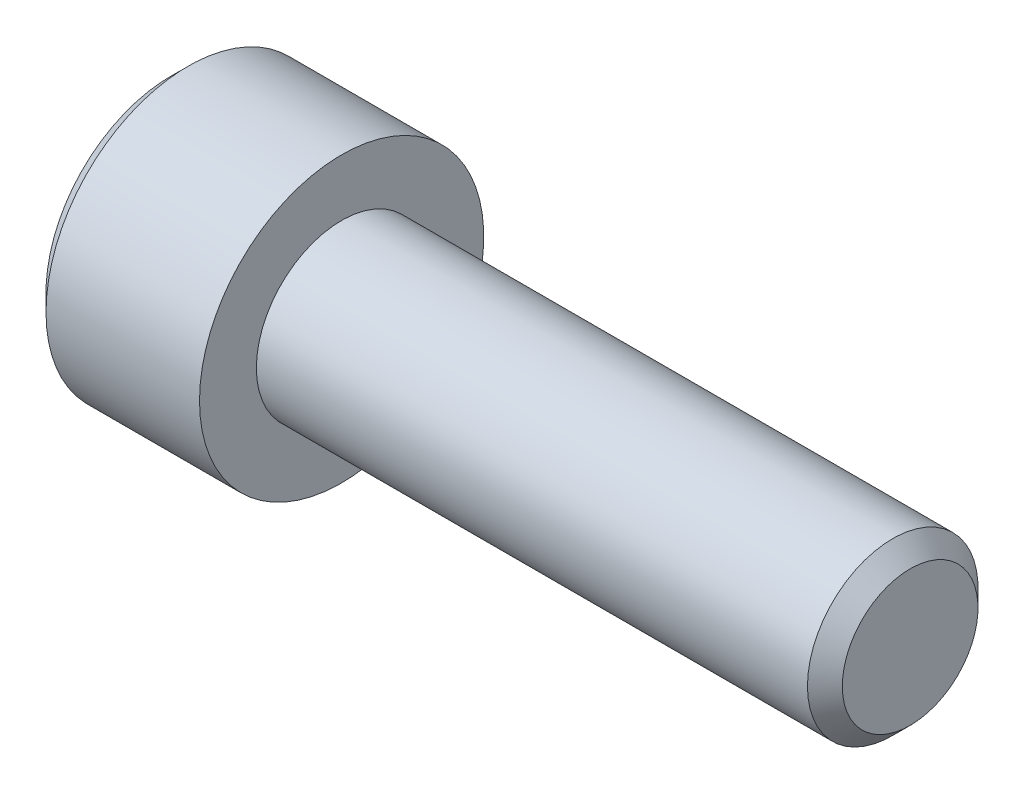
ISO-10303-21;
HEADER;
FILE_DESCRIPTION(('STEP AP214'),'2;1');
FILE_NAME('part.step','',(''),(''),'','','');
FILE_SCHEMA(('AUTOMOTIVE_DESIGN { 1 0 10303 214 1 1 1 1 }'));
ENDSEC;
DATA;
#1=APPLICATION_CONTEXT('core data for automotive mechanical design processes');
#2=APPLICATION_PROTOCOL_DEFINITION('international standard','automotive_design',2000,#1);
#3=PRODUCT_CONTEXT('',#1,'mechanical');
#4=PRODUCT('Part','Part','',(#3));
#5=PRODUCT_RELATED_PRODUCT_CATEGORY('part','',(#4));
#6=PRODUCT_DEFINITION_FORMATION('','',#4);
#7=PRODUCT_DEFINITION_CONTEXT('part definition',#1,'design');
#8=PRODUCT_DEFINITION('design','',#6,#7);
#9=PRODUCT_DEFINITION_SHAPE('','',#8);
#10=(LENGTH_UNIT() NAMED_UNIT(*) SI_UNIT(.MILLI.,.METRE.));
#11=(NAMED_UNIT(*) PLANE_ANGLE_UNIT() SI_UNIT($,.RADIAN.));
#12=(NAMED_UNIT(*) SI_UNIT($,.STERADIAN.) SOLID_ANGLE_UNIT());
#13=UNCERTAINTY_MEASURE_WITH_UNIT(LENGTH_MEASURE(1.E-05),#10,'distance_accuracy_value','');
#14=(GEOMETRIC_REPRESENTATION_CONTEXT(3) GLOBAL_UNCERTAINTY_ASSIGNED_CONTEXT((#13)) GLOBAL_UNIT_ASSIGNED_CONTEXT((#10,
#11,#12)) REPRESENTATION_CONTEXT('',''));
#15=CARTESIAN_POINT('',(0.,0.,0.));
#16=DIRECTION('',(0.,0.,1.));
#17=DIRECTION('',(1.,0.,0.));
#18=AXIS2_PLACEMENT_3D('',#15,#16,#17);
#19=CARTESIAN_POINT('',(-3.,0.,0.));
#20=DIRECTION('',(1.,0.,0.));
#21=DIRECTION('',(0.,0.,-1.));
#22=AXIS2_PLACEMENT_3D('',#19,#20,#21);
#23=PLANE('',#22);
#24=DIRECTION('',(0.,1.,0.));
#25=VECTOR('',#24,1.);
#26=CARTESIAN_POINT('',(-3.,0.,2.5));
#27=LINE('',#26,#25);
#28=CARTESIAN_POINT('',(-3.,1.44337567297406,2.5));
#29=VERTEX_POINT('',#28);
#30=CARTESIAN_POINT('',(-2.99999999999295,0.,2.50000000002729));
#31=VERTEX_POINT('',#30);
#32=EDGE_CURVE('E109',#29,#31,#27,.F.);
#33=ORIENTED_EDGE('',*,*,#32,.F.);
#34=DIRECTION('',(0.,-0.500000000000004,0.866025403784436));
#35=VECTOR('',#34,1.);
#36=CARTESIAN_POINT('',(-3.,2.1650635094611,1.25));
#37=LINE('',#36,#35);
#38=CARTESIAN_POINT('',(-2.99999999999295,2.16506350948473,1.25000000001364));
#39=VERTEX_POINT('',#38);
#40=EDGE_CURVE('E93',#39,#29,#37,.T.);
#41=ORIENTED_EDGE('',*,*,#40,.F.);
#42=CARTESIAN_POINT('',(-2.9999999999859,0.,0.));
#43=DIRECTION('',(-1.,0.,0.));
#44=DIRECTION('',(0.,0.,1.));
#45=AXIS2_PLACEMENT_3D('',#42,#43,#44);
#46=CIRCLE('',#45,2.50000000005457);
#47=EDGE_CURVE('E20',#39,#31,#46,.F.);
#48=ORIENTED_EDGE('',*,*,#47,.T.);
#49=EDGE_LOOP('',(#33,#41,#48));
#50=FACE_BOUND('',#49,.T.);
#51=ADVANCED_FACE('F17',(#50),#23,.F.);
#52=CARTESIAN_POINT('',(-3.,0.,0.));
#53=DIRECTION('',(1.,0.,0.));
#54=DIRECTION('',(0.,0.,-1.));
#55=AXIS2_PLACEMENT_3D('',#52,#53,#54);
#56=PLANE('',#55);
#57=DIRECTION('',(0.,0.499999999999999,-0.866025403784439));
#58=VECTOR('',#57,1.);
#59=CARTESIAN_POINT('',(-3.,-2.88675134594813,0.));
#60=LINE('',#59,#58);
#61=CARTESIAN_POINT('',(-3.,-2.88675134594813,0.));
#62=VERTEX_POINT('',#61);
#63=CARTESIAN_POINT('',(-2.99999999999295,-2.16506350948473,-1.25000000001364));
#64=VERTEX_POINT('',#63);
#65=EDGE_CURVE('E149',#62,#64,#60,.T.);
#66=ORIENTED_EDGE('',*,*,#65,.F.);
#67=DIRECTION('',(0.,-0.499999999999999,-0.866025403784439));
#68=VECTOR('',#67,1.);
#69=CARTESIAN_POINT('',(-3.,-2.1650635094611,1.25));
#70=LINE('',#69,#68);
#71=CARTESIAN_POINT('',(-2.99999999999295,-2.16506350948473,1.25000000001364));
#72=VERTEX_POINT('',#71);
#73=EDGE_CURVE('E153',#72,#62,#70,.T.);
#74=ORIENTED_EDGE('',*,*,#73,.F.);
#75=CARTESIAN_POINT('',(-2.9999999999859,0.,0.));
#76=DIRECTION('',(-1.,0.,0.));
#77=DIRECTION('',(0.,0.,1.));
#78=AXIS2_PLACEMENT_3D('',#75,#76,#77);
#79=CIRCLE('',#78,2.50000000005457);
#80=EDGE_CURVE('E123',#72,#64,#79,.F.);
#81=ORIENTED_EDGE('',*,*,#80,.T.);
#82=EDGE_LOOP('',(#66,#74,#81));
#83=FACE_BOUND('',#82,.T.);
#84=ADVANCED_FACE('F420',(#83),#56,.F.);
#85=CARTESIAN_POINT('',(-3.,0.,0.));
#86=DIRECTION('',(1.,0.,0.));
#87=DIRECTION('',(0.,0.,-1.));
#88=AXIS2_PLACEMENT_3D('',#85,#86,#87);
#89=PLANE('',#88);
#90=DIRECTION('',(0.,1.,0.));
#91=VECTOR('',#90,1.);
#92=CARTESIAN_POINT('',(-3.,0.,-2.5));
#93=LINE('',#92,#91);
#94=CARTESIAN_POINT('',(-3.,-1.44337567297406,-2.5));
#95=VERTEX_POINT('',#94);
#96=CARTESIAN_POINT('',(-2.99999999999295,0.,-2.50000000002729));
#97=VERTEX_POINT('',#96);
#98=EDGE_CURVE('E141',#95,#97,#93,.T.);
#99=ORIENTED_EDGE('',*,*,#98,.F.);
#100=DIRECTION('',(0.,0.500000000000004,-0.866025403784436));
#101=VECTOR('',#100,1.);
#102=CARTESIAN_POINT('',(-3.,-2.1650635094611,-1.25));
#103=LINE('',#102,#101);
#104=EDGE_CURVE('E145',#64,#95,#103,.T.);
#105=ORIENTED_EDGE('',*,*,#104,.F.);
#106=CARTESIAN_POINT('',(-2.9999999999859,0.,0.));
#107=DIRECTION('',(-1.,0.,0.));
#108=DIRECTION('',(0.,0.,1.));
#109=AXIS2_PLACEMENT_3D('',#106,#107,#108);
#110=CIRCLE('',#109,2.50000000005457);
#111=EDGE_CURVE('E125',#64,#97,#110,.F.);
#112=ORIENTED_EDGE('',*,*,#111,.T.);
#113=EDGE_LOOP('',(#99,#105,#112));
#114=FACE_BOUND('',#113,.T.);
#115=ADVANCED_FACE('F207',(#114),#89,.F.);
#116=CARTESIAN_POINT('',(-3.,0.,0.));
#117=DIRECTION('',(1.,0.,0.));
#118=DIRECTION('',(0.,0.,-1.));
#119=AXIS2_PLACEMENT_3D('',#116,#117,#118);
#120=PLANE('',#119);
#121=DIRECTION('',(0.,0.500000000000004,0.866025403784436));
#122=VECTOR('',#121,1.);
#123=CARTESIAN_POINT('',(-3.,1.44337567297406,-2.5));
#124=LINE('',#123,#122);
#125=CARTESIAN_POINT('',(-3.,1.44337567297406,-2.5));
#126=VERTEX_POINT('',#125);
#127=CARTESIAN_POINT('',(-2.99999999999295,2.16506350948473,-1.25000000001364));
#128=VERTEX_POINT('',#127);
#129=EDGE_CURVE('E101',#126,#128,#124,.T.);
#130=ORIENTED_EDGE('',*,*,#129,.F.);
#131=DIRECTION('',(0.,1.,0.));
#132=VECTOR('',#131,1.);
#133=CARTESIAN_POINT('',(-3.,0.,-2.5));
#134=LINE('',#133,#132);
#135=EDGE_CURVE('E137',#97,#126,#134,.T.);
#136=ORIENTED_EDGE('',*,*,#135,.F.);
#137=CARTESIAN_POINT('',(-2.9999999999859,0.,0.));
#138=DIRECTION('',(-1.,0.,0.));
#139=DIRECTION('',(0.,0.,1.));
#140=AXIS2_PLACEMENT_3D('',#137,#138,#139);
#141=CIRCLE('',#140,2.50000000005457);
#142=EDGE_CURVE('E117',#97,#128,#141,.F.);
#143=ORIENTED_EDGE('',*,*,#142,.T.);
#144=EDGE_LOOP('',(#130,#136,#143));
#145=FACE_BOUND('',#144,.T.);
#146=ADVANCED_FACE('F210',(#145),#120,.F.);
#147=CARTESIAN_POINT('',(-3.,0.,0.));
#148=DIRECTION('',(1.,0.,0.));
#149=DIRECTION('',(0.,0.,-1.));
#150=AXIS2_PLACEMENT_3D('',#147,#148,#149);
#151=PLANE('',#150);
#152=CARTESIAN_POINT('',(-2.9999999999859,0.,0.));
#153=DIRECTION('',(-1.,0.,0.));
#154=DIRECTION('',(0.,0.,1.));
#155=AXIS2_PLACEMENT_3D('',#152,#153,#154);
#156=CIRCLE('',#155,2.50000000005457);
#157=EDGE_CURVE('E112',#128,#39,#156,.F.);
#158=ORIENTED_EDGE('',*,*,#157,.T.);
#159=DIRECTION('',(0.,-0.499999999999999,0.866025403784439));
#160=VECTOR('',#159,1.);
#161=CARTESIAN_POINT('',(-3.,2.88675134594813,0.));
#162=LINE('',#161,#160);
#163=CARTESIAN_POINT('',(-3.,2.88675134594813,0.));
#164=VERTEX_POINT('',#163);
#165=EDGE_CURVE('E89',#164,#39,#162,.T.);
#166=ORIENTED_EDGE('',*,*,#165,.F.);
#167=DIRECTION('',(0.,0.499999999999999,0.866025403784439));
#168=VECTOR('',#167,1.);
#169=CARTESIAN_POINT('',(-3.,2.1650635094611,-1.25));
#170=LINE('',#169,#168);
#171=EDGE_CURVE('E100',#128,#164,#170,.T.);
#172=ORIENTED_EDGE('',*,*,#171,.F.);
#173=EDGE_LOOP('',(#158,#166,#172));
#174=FACE_BOUND('',#173,.T.);
#175=ADVANCED_FACE('F113',(#174),#151,.F.);
#176=CARTESIAN_POINT('',(-2.9999999999859,0.,0.));
#177=DIRECTION('',(-1.,0.,0.));
#178=DIRECTION('',(0.,0.,1.));
#179=AXIS2_PLACEMENT_3D('',#176,#177,#178);
#180=CONICAL_SURFACE('',#179,2.50000000005457,1.3089969390114);
#181=CARTESIAN_POINT('',(-2.33012701895063,0.,5.6843418860808E-11));
#182=VERTEX_POINT('',#181);
#183=VERTEX_LOOP('',#182);
#184=FACE_BOUND('',#183,.T.);
#185=ORIENTED_EDGE('',*,*,#142,.F.);
#186=ORIENTED_EDGE('',*,*,#111,.F.);
#187=ORIENTED_EDGE('',*,*,#80,.F.);
#188=CARTESIAN_POINT('',(-2.9999999999859,0.,0.));
#189=DIRECTION('',(-1.,0.,0.));
#190=DIRECTION('',(0.,0.,1.));
#191=AXIS2_PLACEMENT_3D('',#188,#189,#190);
#192=CIRCLE('',#191,2.50000000005457);
#193=EDGE_CURVE('E116',#72,#31,#192,.T.);
#194=ORIENTED_EDGE('',*,*,#193,.T.);
#195=ORIENTED_EDGE('',*,*,#47,.F.);
#196=ORIENTED_EDGE('',*,*,#157,.F.);
#197=EDGE_LOOP('',(#185,#186,#187,#194,#195,#196));
#198=FACE_BOUND('',#197,.T.);
#199=ADVANCED_FACE('F119',(#184,#198),#180,.F.);
#200=CARTESIAN_POINT('',(-3.,0.,0.));
#201=DIRECTION('',(1.,0.,0.));
#202=DIRECTION('',(0.,0.,-1.));
#203=AXIS2_PLACEMENT_3D('',#200,#201,#202);
#204=PLANE('',#203);
#205=DIRECTION('',(0.,0.5,0.866025403784439));
#206=VECTOR('',#205,1.);
#207=CARTESIAN_POINT('',(-3.,-1.44337567297406,2.5));
#208=LINE('',#207,#206);
#209=CARTESIAN_POINT('',(-3.,-1.44337567297406,2.5));
#210=VERTEX_POINT('',#209);
#211=EDGE_CURVE('E197',#210,#72,#208,.F.);
#212=ORIENTED_EDGE('',*,*,#211,.F.);
#213=DIRECTION('',(0.,1.,0.));
#214=VECTOR('',#213,1.);
#215=CARTESIAN_POINT('',(-3.,1.44337567297406,2.5));
#216=LINE('',#215,#214);
#217=EDGE_CURVE('E227',#31,#210,#216,.F.);
#218=ORIENTED_EDGE('',*,*,#217,.F.);
#219=ORIENTED_EDGE('',*,*,#193,.F.);
#220=EDGE_LOOP('',(#212,#218,#219));
#221=FACE_BOUND('',#220,.T.);
#222=ADVANCED_FACE('F240',(#221),#204,.F.);
#223=CARTESIAN_POINT('',(-3.,-1.44337567297406,2.5));
#224=DIRECTION('',(0.,0.866025403784439,-0.5));
#225=DIRECTION('',(0.,0.5,0.866025403784439));
#226=AXIS2_PLACEMENT_3D('',#223,#224,#225);
#227=PLANE('',#226);
#228=ORIENTED_EDGE('',*,*,#73,.T.);
#229=DIRECTION('',(1.,0.,0.));
#230=VECTOR('',#229,1.);
#231=CARTESIAN_POINT('',(-3.,-2.88675134594813,0.));
#232=LINE('',#231,#230);
#233=CARTESIAN_POINT('',(-6.,-2.88675134594813,0.));
#234=VERTEX_POINT('',#233);
#235=EDGE_CURVE('E170',#234,#62,#232,.T.);
#236=ORIENTED_EDGE('',*,*,#235,.F.);
#237=DIRECTION('',(0.,0.500000000000001,0.866025403784438));
#238=VECTOR('',#237,1.);
#239=CARTESIAN_POINT('',(-6.,-2.88675134594813,0.));
#240=LINE('',#239,#238);
#241=CARTESIAN_POINT('',(-6.,-1.44337567297406,2.5));
#242=VERTEX_POINT('',#241);
#243=EDGE_CURVE('E175',#234,#242,#240,.T.);
#244=ORIENTED_EDGE('',*,*,#243,.T.);
#245=DIRECTION('',(-1.,0.,0.));
#246=VECTOR('',#245,1.);
#247=CARTESIAN_POINT('',(-3.,-1.44337567297406,2.5));
#248=LINE('',#247,#246);
#249=EDGE_CURVE('E183',#210,#242,#248,.T.);
#250=ORIENTED_EDGE('',*,*,#249,.F.);
#251=ORIENTED_EDGE('',*,*,#211,.T.);
#252=EDGE_LOOP('',(#228,#236,#244,#250,#251));
#253=FACE_BOUND('',#252,.T.);
#254=ADVANCED_FACE('F238',(#253),#227,.T.);
#255=CARTESIAN_POINT('',(-3.,1.44337567297406,2.5));
#256=DIRECTION('',(0.,0.,-1.));
#257=DIRECTION('',(-1.,0.,0.));
#258=AXIS2_PLACEMENT_3D('',#255,#256,#257);
#259=PLANE('',#258);
#260=ORIENTED_EDGE('',*,*,#217,.T.);
#261=ORIENTED_EDGE('',*,*,#249,.T.);
#262=DIRECTION('',(0.,1.,0.));
#263=VECTOR('',#262,1.);
#264=CARTESIAN_POINT('',(-6.,0.,2.5));
#265=LINE('',#264,#263);
#266=CARTESIAN_POINT('',(-6.,1.44337567297406,2.5));
#267=VERTEX_POINT('',#266);
#268=EDGE_CURVE('E221',#242,#267,#265,.T.);
#269=ORIENTED_EDGE('',*,*,#268,.T.);
#270=DIRECTION('',(1.,0.,0.));
#271=VECTOR('',#270,1.);
#272=CARTESIAN_POINT('',(-3.,1.44337567297406,2.5));
#273=LINE('',#272,#271);
#274=EDGE_CURVE('E166',#29,#267,#273,.F.);
#275=ORIENTED_EDGE('',*,*,#274,.F.);
#276=ORIENTED_EDGE('',*,*,#32,.T.);
#277=EDGE_LOOP('',(#260,#261,#269,#275,#276));
#278=FACE_BOUND('',#277,.T.);
#279=ADVANCED_FACE('F242',(#278),#259,.T.);
#280=CARTESIAN_POINT('',(-3.,2.88675134594813,0.));
#281=DIRECTION('',(0.,-0.866025403784439,-0.5));
#282=DIRECTION('',(0.,0.5,-0.866025403784439));
#283=AXIS2_PLACEMENT_3D('',#280,#281,#282);
#284=PLANE('',#283);
#285=ORIENTED_EDGE('',*,*,#40,.T.);
#286=ORIENTED_EDGE('',*,*,#274,.T.);
#287=DIRECTION('',(0.,0.500000000000001,-0.866025403784438));
#288=VECTOR('',#287,1.);
#289=CARTESIAN_POINT('',(-6.,1.44337567297406,2.5));
#290=LINE('',#289,#288);
#291=CARTESIAN_POINT('',(-6.,2.88675134594813,0.));
#292=VERTEX_POINT('',#291);
#293=EDGE_CURVE('E218',#267,#292,#290,.T.);
#294=ORIENTED_EDGE('',*,*,#293,.T.);
#295=DIRECTION('',(1.,0.,0.));
#296=VECTOR('',#295,1.);
#297=CARTESIAN_POINT('',(-3.,2.88675134594813,0.));
#298=LINE('',#297,#296);
#299=EDGE_CURVE('E96',#164,#292,#298,.F.);
#300=ORIENTED_EDGE('',*,*,#299,.F.);
#301=ORIENTED_EDGE('',*,*,#165,.T.);
#302=EDGE_LOOP('',(#285,#286,#294,#300,#301));
#303=FACE_BOUND('',#302,.T.);
#304=ADVANCED_FACE('F91',(#303),#284,.T.);
#305=CARTESIAN_POINT('',(-3.,1.44337567297406,-2.5));
#306=DIRECTION('',(0.,-0.866025403784439,0.5));
#307=DIRECTION('',(0.,-0.5,-0.866025403784439));
#308=AXIS2_PLACEMENT_3D('',#305,#306,#307);
#309=PLANE('',#308);
#310=ORIENTED_EDGE('',*,*,#171,.T.);
#311=ORIENTED_EDGE('',*,*,#299,.T.);
#312=DIRECTION('',(0.,-0.500000000000001,-0.866025403784438));
#313=VECTOR('',#312,1.);
#314=CARTESIAN_POINT('',(-6.,2.88675134594813,0.));
#315=LINE('',#314,#313);
#316=CARTESIAN_POINT('',(-6.,1.44337567297406,-2.5));
#317=VERTEX_POINT('',#316);
#318=EDGE_CURVE('E215',#292,#317,#315,.T.);
#319=ORIENTED_EDGE('',*,*,#318,.T.);
#320=DIRECTION('',(1.,0.,0.));
#321=VECTOR('',#320,1.);
#322=CARTESIAN_POINT('',(-3.,1.44337567297406,-2.5));
#323=LINE('',#322,#321);
#324=EDGE_CURVE('E165',#126,#317,#323,.F.);
#325=ORIENTED_EDGE('',*,*,#324,.F.);
#326=ORIENTED_EDGE('',*,*,#129,.T.);
#327=EDGE_LOOP('',(#310,#311,#319,#325,#326));
#328=FACE_BOUND('',#327,.T.);
#329=ADVANCED_FACE('F213',(#328),#309,.T.);
#330=CARTESIAN_POINT('',(-3.,-1.44337567297406,-2.5));
#331=DIRECTION('',(0.,0.,1.));
#332=DIRECTION('',(1.,0.,0.));
#333=AXIS2_PLACEMENT_3D('',#330,#331,#332);
#334=PLANE('',#333);
#335=ORIENTED_EDGE('',*,*,#135,.T.);
#336=ORIENTED_EDGE('',*,*,#324,.T.);
#337=DIRECTION('',(0.,1.,0.));
#338=VECTOR('',#337,1.);
#339=CARTESIAN_POINT('',(-6.,0.,-2.5));
#340=LINE('',#339,#338);
#341=CARTESIAN_POINT('',(-6.,-1.44337567297406,-2.5));
#342=VERTEX_POINT('',#341);
#343=EDGE_CURVE('E35',#317,#342,#340,.F.);
#344=ORIENTED_EDGE('',*,*,#343,.T.);
#345=DIRECTION('',(1.,0.,0.));
#346=VECTOR('',#345,1.);
#347=CARTESIAN_POINT('',(-3.,-1.44337567297406,-2.5));
#348=LINE('',#347,#346);
#349=EDGE_CURVE('E173',#95,#342,#348,.F.);
#350=ORIENTED_EDGE('',*,*,#349,.F.);
#351=ORIENTED_EDGE('',*,*,#98,.T.);
#352=EDGE_LOOP('',(#335,#336,#344,#350,#351));
#353=FACE_BOUND('',#352,.T.);
#354=ADVANCED_FACE('F212',(#353),#334,.T.);
#355=CARTESIAN_POINT('',(-3.,-2.88675134594813,0.));
#356=DIRECTION('',(0.,0.866025403784439,0.5));
#357=DIRECTION('',(0.,-0.5,0.866025403784439));
#358=AXIS2_PLACEMENT_3D('',#355,#356,#357);
#359=PLANE('',#358);
#360=ORIENTED_EDGE('',*,*,#104,.T.);
#361=ORIENTED_EDGE('',*,*,#349,.T.);
#362=DIRECTION('',(0.,-0.500000000000001,0.866025403784438));
#363=VECTOR('',#362,1.);
#364=CARTESIAN_POINT('',(-6.,-1.44337567297406,-2.5));
#365=LINE('',#364,#363);
#366=EDGE_CURVE('E196',#342,#234,#365,.T.);
#367=ORIENTED_EDGE('',*,*,#366,.T.);
#368=ORIENTED_EDGE('',*,*,#235,.T.);
#369=ORIENTED_EDGE('',*,*,#65,.T.);
#370=EDGE_LOOP('',(#360,#361,#367,#368,#369));
#371=FACE_BOUND('',#370,.T.);
#372=ADVANCED_FACE('F251',(#371),#359,.T.);
#373=CARTESIAN_POINT('',(-6.,0.,0.));
#374=DIRECTION('',(1.,0.,0.));
#375=DIRECTION('',(0.,0.,-1.));
#376=AXIS2_PLACEMENT_3D('',#373,#374,#375);
#377=PLANE('',#376);
#378=ORIENTED_EDGE('',*,*,#343,.F.);
#379=ORIENTED_EDGE('',*,*,#318,.F.);
#380=ORIENTED_EDGE('',*,*,#293,.F.);
#381=ORIENTED_EDGE('',*,*,#268,.F.);
#382=ORIENTED_EDGE('',*,*,#243,.F.);
#383=ORIENTED_EDGE('',*,*,#366,.F.);
#384=EDGE_LOOP('',(#378,#379,#380,#381,#382,#383));
#385=FACE_BOUND('',#384,.T.);
#386=CARTESIAN_POINT('',(-5.99999999997181,0.,0.));
#387=DIRECTION('',(1.,0.,0.));
#388=DIRECTION('',(0.,0.,-1.));
#389=AXIS2_PLACEMENT_3D('',#386,#387,#388);
#390=CIRCLE('',#389,4.39999999997553);
#391=CARTESIAN_POINT('',(-5.99999999997181,0.,-4.39999999997553));
#392=VERTEX_POINT('',#391);
#393=EDGE_CURVE('E193',#392,#392,#390,.T.);
#394=ORIENTED_EDGE('',*,*,#393,.F.);
#395=EDGE_LOOP('',(#394));
#396=FACE_BOUND('',#395,.T.);
#397=ADVANCED_FACE('F244',(#385,#396),#377,.F.);
#398=CARTESIAN_POINT('',(-5.40000000006557,0.,0.));
#399=DIRECTION('',(1.,0.,0.));
#400=DIRECTION('',(0.,0.,-1.));
#401=AXIS2_PLACEMENT_3D('',#398,#399,#400);
#402=CONICAL_SURFACE('',#401,4.99999999988177,0.785398163397448);
#403=ORIENTED_EDGE('',*,*,#393,.T.);
#404=EDGE_LOOP('',(#403));
#405=FACE_BOUND('',#404,.T.);
#406=CARTESIAN_POINT('',(-5.4,0.,0.));
#407=DIRECTION('',(-1.,0.,0.));
#408=DIRECTION('',(0.,0.,1.));
#409=AXIS2_PLACEMENT_3D('',#406,#407,#408);
#410=CIRCLE('',#409,5.);
#411=CARTESIAN_POINT('',(-5.4,0.,5.));
#412=VERTEX_POINT('',#411);
#413=EDGE_CURVE('E192',#412,#412,#410,.F.);
#414=ORIENTED_EDGE('',*,*,#413,.F.);
#415=EDGE_LOOP('',(#414));
#416=FACE_BOUND('',#415,.T.);
#417=ADVANCED_FACE('F274',(#405,#416),#402,.T.);
#418=CARTESIAN_POINT('',(20.,2.3865,0.));
#419=DIRECTION('',(-1.,0.,0.));
#420=DIRECTION('',(0.,0.,1.));
#421=AXIS2_PLACEMENT_3D('',#418,#419,#420);
#422=PLANE('',#421);
#423=CARTESIAN_POINT('',(19.999999999925,0.,0.));
#424=DIRECTION('',(-1.,0.,0.));
#425=DIRECTION('',(0.,0.,1.));
#426=AXIS2_PLACEMENT_3D('',#423,#424,#425);
#427=CIRCLE('',#426,2.38650000000007);
#428=CARTESIAN_POINT('',(19.999999999925,0.,2.38650000000007));
#429=VERTEX_POINT('',#428);
#430=EDGE_CURVE('E189',#429,#429,#427,.T.);
#431=ORIENTED_EDGE('',*,*,#430,.F.);
#432=EDGE_LOOP('',(#431));
#433=FACE_BOUND('',#432,.T.);
#434=ADVANCED_FACE('F272',(#433),#422,.F.);
#435=CARTESIAN_POINT('',(20.,0.,0.));
#436=DIRECTION('',(-1.,0.,0.));
#437=DIRECTION('',(0.,0.,1.));
#438=AXIS2_PLACEMENT_3D('',#435,#436,#437);
#439=CYLINDRICAL_SURFACE('',#438,5.);
#440=ORIENTED_EDGE('',*,*,#413,.T.);
#441=EDGE_LOOP('',(#440));
#442=FACE_BOUND('',#441,.T.);
#443=CARTESIAN_POINT('',(0.,0.,0.));
#444=DIRECTION('',(-1.,0.,0.));
#445=DIRECTION('',(0.,0.,1.));
#446=AXIS2_PLACEMENT_3D('',#443,#444,#445);
#447=CIRCLE('',#446,5.);
#448=CARTESIAN_POINT('',(0.,0.,5.));
#449=VERTEX_POINT('',#448);
#450=EDGE_CURVE('E186',#449,#449,#447,.T.);
#451=ORIENTED_EDGE('',*,*,#450,.T.);
#452=EDGE_LOOP('',(#451));
#453=FACE_BOUND('',#452,.T.);
#454=ADVANCED_FACE('F268',(#442,#453),#439,.T.);
#455=CARTESIAN_POINT('',(19.3864999999391,0.,0.));
#456=DIRECTION('',(-1.,0.,0.));
#457=DIRECTION('',(0.,0.,1.));
#458=AXIS2_PLACEMENT_3D('',#455,#456,#457);
#459=CONICAL_SURFACE('',#458,2.9999999999859,0.785398163397448);
#460=CARTESIAN_POINT('',(19.3865,0.,0.));
#461=DIRECTION('',(-1.,0.,0.));
#462=DIRECTION('',(0.,0.,1.));
#463=AXIS2_PLACEMENT_3D('',#460,#461,#462);
#464=CIRCLE('',#463,3.);
#465=CARTESIAN_POINT('',(19.3865,0.,3.));
#466=VERTEX_POINT('',#465);
#467=EDGE_CURVE('E26',#466,#466,#464,.T.);
#468=ORIENTED_EDGE('',*,*,#467,.F.);
#469=EDGE_LOOP('',(#468));
#470=FACE_BOUND('',#469,.T.);
#471=ORIENTED_EDGE('',*,*,#430,.T.);
#472=EDGE_LOOP('',(#471));
#473=FACE_BOUND('',#472,.T.);
#474=ADVANCED_FACE('F264',(#470,#473),#459,.T.);
#475=CARTESIAN_POINT('',(0.,5.,0.));
#476=DIRECTION('',(-1.,0.,0.));
#477=DIRECTION('',(0.,0.,1.));
#478=AXIS2_PLACEMENT_3D('',#475,#476,#477);
#479=PLANE('',#478);
#480=ORIENTED_EDGE('',*,*,#450,.F.);
#481=EDGE_LOOP('',(#480));
#482=FACE_BOUND('',#481,.T.);
#483=CARTESIAN_POINT('',(0.,0.,0.));
#484=DIRECTION('',(-1.,0.,0.));
#485=DIRECTION('',(0.,0.,1.));
#486=AXIS2_PLACEMENT_3D('',#483,#484,#485);
#487=CIRCLE('',#486,3.);
#488=CARTESIAN_POINT('',(0.,0.,3.));
#489=VERTEX_POINT('',#488);
#490=EDGE_CURVE('E11',#489,#489,#487,.F.);
#491=ORIENTED_EDGE('',*,*,#490,.F.);
#492=EDGE_LOOP('',(#491));
#493=FACE_BOUND('',#492,.T.);
#494=ADVANCED_FACE('F267',(#482,#493),#479,.F.);
#495=CARTESIAN_POINT('',(20.,0.,0.));
#496=DIRECTION('',(-1.,0.,0.));
#497=DIRECTION('',(0.,0.,1.));
#498=AXIS2_PLACEMENT_3D('',#495,#496,#497);
#499=CYLINDRICAL_SURFACE('',#498,3.);
#500=ORIENTED_EDGE('',*,*,#490,.T.);
#501=EDGE_LOOP('',(#500));
#502=FACE_BOUND('',#501,.T.);
#503=ORIENTED_EDGE('',*,*,#467,.T.);
#504=EDGE_LOOP('',(#503));
#505=FACE_BOUND('',#504,.T.);
#506=ADVANCED_FACE('F262',(#502,#505),#499,.T.);
#507=CLOSED_SHELL('',(#51,#84,#115,#146,#175,#199,#222,#254,#279,#304,#329,#354,#372,#397,#417,
#434,#454,#474,#494,#506));
#508=MANIFOLD_SOLID_BREP('B1',#507);
#509=ADVANCED_BREP_SHAPE_REPRESENTATION('',(#18,#508),#14);
#510=SHAPE_DEFINITION_REPRESENTATION(#9,#509);
ENDSEC;
END-ISO-10303-21;
